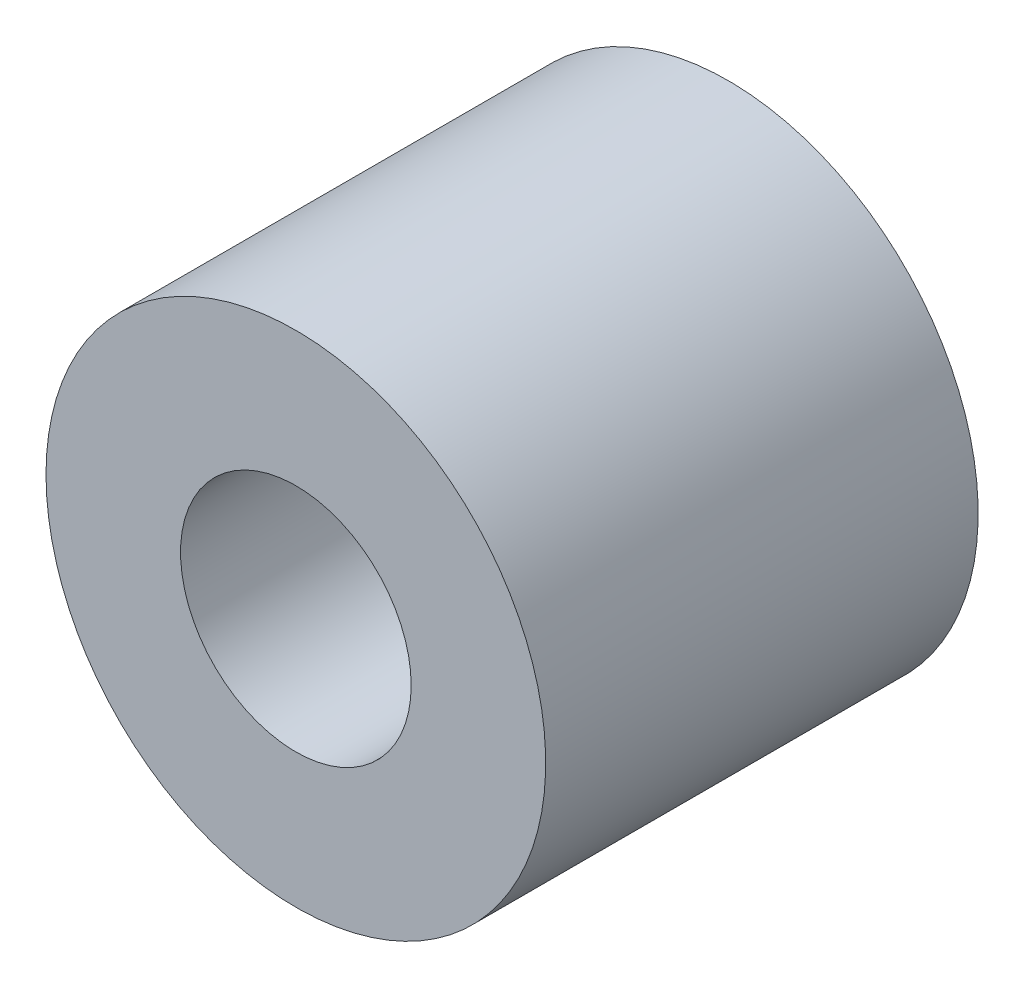
ISO-10303-21;
HEADER;
FILE_DESCRIPTION(('STEP AP214'),'2;1');
FILE_NAME('part.step','',(''),(''),'','','');
FILE_SCHEMA(('AUTOMOTIVE_DESIGN { 1 0 10303 214 1 1 1 1 }'));
ENDSEC;
DATA;
#1=APPLICATION_CONTEXT('core data for automotive mechanical design processes');
#2=APPLICATION_PROTOCOL_DEFINITION('international standard','automotive_design',2000,#1);
#3=PRODUCT_CONTEXT('',#1,'mechanical');
#4=PRODUCT('Part','Part','',(#3));
#5=PRODUCT_RELATED_PRODUCT_CATEGORY('part','',(#4));
#6=PRODUCT_DEFINITION_FORMATION('','',#4);
#7=PRODUCT_DEFINITION_CONTEXT('part definition',#1,'design');
#8=PRODUCT_DEFINITION('design','',#6,#7);
#9=PRODUCT_DEFINITION_SHAPE('','',#8);
#10=(LENGTH_UNIT() NAMED_UNIT(*) SI_UNIT(.MILLI.,.METRE.));
#11=(NAMED_UNIT(*) PLANE_ANGLE_UNIT() SI_UNIT($,.RADIAN.));
#12=(NAMED_UNIT(*) SI_UNIT($,.STERADIAN.) SOLID_ANGLE_UNIT());
#13=UNCERTAINTY_MEASURE_WITH_UNIT(LENGTH_MEASURE(1.E-05),#10,'distance_accuracy_value','');
#14=(GEOMETRIC_REPRESENTATION_CONTEXT(3) GLOBAL_UNCERTAINTY_ASSIGNED_CONTEXT((#13)) GLOBAL_UNIT_ASSIGNED_CONTEXT((#10,
#11,#12)) REPRESENTATION_CONTEXT('',''));
#15=CARTESIAN_POINT('',(0.,0.,0.));
#16=DIRECTION('',(0.,0.,1.));
#17=DIRECTION('',(1.,0.,0.));
#18=AXIS2_PLACEMENT_3D('',#15,#16,#17);
#19=CARTESIAN_POINT('',(0.,0.,45.));
#20=DIRECTION('',(0.,0.,-1.));
#21=DIRECTION('',(-1.,0.,0.));
#22=AXIS2_PLACEMENT_3D('',#19,#20,#21);
#23=CYLINDRICAL_SURFACE('',#22,26.);
#24=CARTESIAN_POINT('',(0.,0.,45.));
#25=DIRECTION('',(0.,0.,1.));
#26=DIRECTION('',(1.,0.,0.));
#27=AXIS2_PLACEMENT_3D('',#24,#25,#26);
#28=CIRCLE('',#27,26.);
#29=CARTESIAN_POINT('',(-26.,0.,45.));
#30=VERTEX_POINT('',#29);
#31=EDGE_CURVE('E10',#30,#30,#28,.T.);
#32=CARTESIAN_POINT('',(0.,0.,0.));
#33=DIRECTION('',(0.,0.,1.));
#34=DIRECTION('',(1.,0.,0.));
#35=AXIS2_PLACEMENT_3D('',#32,#33,#34);
#36=CIRCLE('',#35,26.);
#37=CARTESIAN_POINT('',(-26.,0.,0.));
#38=VERTEX_POINT('',#37);
#39=EDGE_CURVE('E36',#38,#38,#36,.T.);
#40=CARTESIAN_POINT('',(-26.,0.,45.));
#41=CARTESIAN_POINT('',(-26.,0.,44.53125));
#42=CARTESIAN_POINT('',(-26.,0.,44.0625));
#43=CARTESIAN_POINT('',(-26.,0.,43.125));
#44=CARTESIAN_POINT('',(-26.,0.,42.65625));
#45=CARTESIAN_POINT('',(-26.,0.,41.71875));
#46=CARTESIAN_POINT('',(-26.,0.,41.25));
#47=CARTESIAN_POINT('',(-26.,0.,40.3125));
#48=CARTESIAN_POINT('',(-26.,0.,39.84375));
#49=CARTESIAN_POINT('',(-26.,0.,38.90625));
#50=CARTESIAN_POINT('',(-26.,0.,38.4375));
#51=CARTESIAN_POINT('',(-26.,0.,37.5));
#52=CARTESIAN_POINT('',(-26.,0.,37.03125));
#53=CARTESIAN_POINT('',(-26.,0.,36.09375));
#54=CARTESIAN_POINT('',(-26.,0.,35.625));
#55=CARTESIAN_POINT('',(-26.,0.,34.6875));
#56=CARTESIAN_POINT('',(-26.,0.,34.21875));
#57=CARTESIAN_POINT('',(-26.,0.,33.28125));
#58=CARTESIAN_POINT('',(-26.,0.,32.8125));
#59=CARTESIAN_POINT('',(-26.,0.,31.875));
#60=CARTESIAN_POINT('',(-26.,0.,31.40625));
#61=CARTESIAN_POINT('',(-26.,0.,30.46875));
#62=CARTESIAN_POINT('',(-26.,0.,30.));
#63=CARTESIAN_POINT('',(-26.,0.,29.0625));
#64=CARTESIAN_POINT('',(-26.,0.,28.59375));
#65=CARTESIAN_POINT('',(-26.,0.,27.65625));
#66=CARTESIAN_POINT('',(-26.,0.,27.1875));
#67=CARTESIAN_POINT('',(-26.,0.,26.25));
#68=CARTESIAN_POINT('',(-26.,0.,25.78125));
#69=CARTESIAN_POINT('',(-26.,0.,24.84375));
#70=CARTESIAN_POINT('',(-26.,0.,24.375));
#71=CARTESIAN_POINT('',(-26.,0.,23.4375));
#72=CARTESIAN_POINT('',(-26.,0.,22.96875));
#73=CARTESIAN_POINT('',(-26.,0.,22.03125));
#74=CARTESIAN_POINT('',(-26.,0.,21.5625));
#75=CARTESIAN_POINT('',(-26.,0.,20.625));
#76=CARTESIAN_POINT('',(-26.,0.,20.15625));
#77=CARTESIAN_POINT('',(-26.,0.,19.21875));
#78=CARTESIAN_POINT('',(-26.,0.,18.75));
#79=CARTESIAN_POINT('',(-26.,0.,17.8125));
#80=CARTESIAN_POINT('',(-26.,0.,17.34375));
#81=CARTESIAN_POINT('',(-26.,0.,16.40625));
#82=CARTESIAN_POINT('',(-26.,0.,15.9375));
#83=CARTESIAN_POINT('',(-26.,0.,15.));
#84=CARTESIAN_POINT('',(-26.,0.,14.53125));
#85=CARTESIAN_POINT('',(-26.,0.,13.59375));
#86=CARTESIAN_POINT('',(-26.,0.,13.125));
#87=CARTESIAN_POINT('',(-26.,0.,12.1875));
#88=CARTESIAN_POINT('',(-26.,0.,11.71875));
#89=CARTESIAN_POINT('',(-26.,0.,10.78125));
#90=CARTESIAN_POINT('',(-26.,0.,10.3125));
#91=CARTESIAN_POINT('',(-26.,0.,9.375));
#92=CARTESIAN_POINT('',(-26.,0.,8.90625));
#93=CARTESIAN_POINT('',(-26.,0.,7.96874999999999));
#94=CARTESIAN_POINT('',(-26.,0.,7.5));
#95=CARTESIAN_POINT('',(-26.,0.,6.5625));
#96=CARTESIAN_POINT('',(-26.,0.,6.09375));
#97=CARTESIAN_POINT('',(-26.,0.,5.15625));
#98=CARTESIAN_POINT('',(-26.,0.,4.68749999999999));
#99=CARTESIAN_POINT('',(-26.,0.,3.74999999999999));
#100=CARTESIAN_POINT('',(-26.,0.,3.28124999999999));
#101=CARTESIAN_POINT('',(-26.,0.,2.34374999999999));
#102=CARTESIAN_POINT('',(-26.,0.,1.87499999999999));
#103=CARTESIAN_POINT('',(-26.,0.,0.937499999999992));
#104=CARTESIAN_POINT('',(-26.,0.,0.468749999999993));
#105=CARTESIAN_POINT('',(-26.,0.,0.));
#106=B_SPLINE_CURVE_WITH_KNOTS('',3,(#40,#41,#42,#43,#44,#45,#46,#47,#48,#49,#50,#51,#52,#53,
#54,#55,#56,#57,#58,#59,#60,#61,#62,#63,#64,#65,#66,#67,#68,#69,#70,#71,#72,#73,#74,#75,#76,#77,
#78,#79,#80,#81,#82,#83,#84,#85,#86,#87,#88,#89,#90,#91,#92,#93,#94,#95,#96,#97,#98,#99,#100,
#101,#102,#103,#104,#105),.UNSPECIFIED.,.F.,.F.,(4,2,2,2,2,2,2,2,2,2,2,2,2,2,2,2,2,2,2,2,2,2,2,
2,2,2,2,2,2,2,2,2,4),(0.,1.40625,2.8125,4.21875000000001,5.62500000000001,7.03125,8.4375,
9.84375000000001,11.25,12.65625,14.0625,15.46875,16.875,18.28125,19.6875,21.09375,22.5,23.90625,
25.3125,26.71875,28.125,29.53125,30.9375,32.34375,33.75,35.15625,36.5625,37.96875,39.375,
40.78125,42.1875,43.59375,45.),.UNSPECIFIED.);
#107=EDGE_CURVE('BSEAM33',#30,#38,#106,.T.);
#108=ORIENTED_EDGE('',*,*,#31,.F.);
#109=ORIENTED_EDGE('',*,*,#39,.T.);
#110=ORIENTED_EDGE('',*,*,#107,.T.);
#111=ORIENTED_EDGE('',*,*,#107,.F.);
#112=EDGE_LOOP('',(#108,#110,#109,#111));
#113=FACE_BOUND('',#112,.T.);
#114=ADVANCED_FACE('F33',(#113),#23,.T.);
#115=CARTESIAN_POINT('',(0.,0.,45.));
#116=DIRECTION('',(0.,0.,1.));
#117=DIRECTION('',(1.,0.,0.));
#118=AXIS2_PLACEMENT_3D('',#115,#116,#117);
#119=PLANE('',#118);
#120=CARTESIAN_POINT('',(0.,0.,45.));
#121=DIRECTION('',(0.,0.,1.));
#122=DIRECTION('',(1.,0.,0.));
#123=AXIS2_PLACEMENT_3D('',#120,#121,#122);
#124=CIRCLE('',#123,12.);
#125=CARTESIAN_POINT('',(12.,0.,45.));
#126=VERTEX_POINT('',#125);
#127=EDGE_CURVE('E45',#126,#126,#124,.T.);
#128=ORIENTED_EDGE('',*,*,#127,.F.);
#129=EDGE_LOOP('',(#128));
#130=FACE_BOUND('',#129,.T.);
#131=ORIENTED_EDGE('',*,*,#31,.T.);
#132=EDGE_LOOP('',(#131));
#133=FACE_BOUND('',#132,.T.);
#134=ADVANCED_FACE('F60',(#130,#133),#119,.T.);
#135=CARTESIAN_POINT('',(0.,0.,0.));
#136=DIRECTION('',(0.,0.,1.));
#137=DIRECTION('',(1.,0.,0.));
#138=AXIS2_PLACEMENT_3D('',#135,#136,#137);
#139=PLANE('',#138);
#140=CARTESIAN_POINT('',(0.,0.,0.));
#141=DIRECTION('',(0.,0.,1.));
#142=DIRECTION('',(1.,0.,0.));
#143=AXIS2_PLACEMENT_3D('',#140,#141,#142);
#144=CIRCLE('',#143,12.);
#145=CARTESIAN_POINT('',(12.,0.,0.));
#146=VERTEX_POINT('',#145);
#147=EDGE_CURVE('E43',#146,#146,#144,.T.);
#148=ORIENTED_EDGE('',*,*,#147,.T.);
#149=EDGE_LOOP('',(#148));
#150=FACE_BOUND('',#149,.T.);
#151=ORIENTED_EDGE('',*,*,#39,.F.);
#152=EDGE_LOOP('',(#151));
#153=FACE_BOUND('',#152,.T.);
#154=ADVANCED_FACE('F51',(#150,#153),#139,.F.);
#155=CARTESIAN_POINT('',(0.,0.,0.));
#156=DIRECTION('',(0.,0.,1.));
#157=DIRECTION('',(1.,0.,0.));
#158=AXIS2_PLACEMENT_3D('',#155,#156,#157);
#159=CYLINDRICAL_SURFACE('',#158,12.);
#160=CARTESIAN_POINT('',(12.,0.,0.));
#161=CARTESIAN_POINT('',(12.,0.,0.468749999999999));
#162=CARTESIAN_POINT('',(12.,0.,0.9375));
#163=CARTESIAN_POINT('',(12.,0.,1.875));
#164=CARTESIAN_POINT('',(12.,0.,2.34375));
#165=CARTESIAN_POINT('',(12.,0.,3.28125));
#166=CARTESIAN_POINT('',(12.,0.,3.75));
#167=CARTESIAN_POINT('',(12.,0.,4.6875));
#168=CARTESIAN_POINT('',(12.,0.,5.15625));
#169=CARTESIAN_POINT('',(12.,0.,6.09375));
#170=CARTESIAN_POINT('',(12.,0.,6.5625));
#171=CARTESIAN_POINT('',(12.,0.,7.5));
#172=CARTESIAN_POINT('',(12.,0.,7.96875));
#173=CARTESIAN_POINT('',(12.,0.,8.90625));
#174=CARTESIAN_POINT('',(12.,0.,9.375));
#175=CARTESIAN_POINT('',(12.,0.,10.3125));
#176=CARTESIAN_POINT('',(12.,0.,10.78125));
#177=CARTESIAN_POINT('',(12.,0.,11.71875));
#178=CARTESIAN_POINT('',(12.,0.,12.1875));
#179=CARTESIAN_POINT('',(12.,0.,13.125));
#180=CARTESIAN_POINT('',(12.,0.,13.59375));
#181=CARTESIAN_POINT('',(12.,0.,14.53125));
#182=CARTESIAN_POINT('',(12.,0.,15.));
#183=CARTESIAN_POINT('',(12.,0.,15.9375));
#184=CARTESIAN_POINT('',(12.,0.,16.40625));
#185=CARTESIAN_POINT('',(12.,0.,17.34375));
#186=CARTESIAN_POINT('',(12.,0.,17.8125));
#187=CARTESIAN_POINT('',(12.,0.,18.75));
#188=CARTESIAN_POINT('',(12.,0.,19.21875));
#189=CARTESIAN_POINT('',(12.,0.,20.15625));
#190=CARTESIAN_POINT('',(12.,0.,20.625));
#191=CARTESIAN_POINT('',(12.,0.,21.5625));
#192=CARTESIAN_POINT('',(12.,0.,22.03125));
#193=CARTESIAN_POINT('',(12.,0.,22.96875));
#194=CARTESIAN_POINT('',(12.,0.,23.4375));
#195=CARTESIAN_POINT('',(12.,0.,24.375));
#196=CARTESIAN_POINT('',(12.,0.,24.84375));
#197=CARTESIAN_POINT('',(12.,0.,25.78125));
#198=CARTESIAN_POINT('',(12.,0.,26.25));
#199=CARTESIAN_POINT('',(12.,0.,27.1875));
#200=CARTESIAN_POINT('',(12.,0.,27.65625));
#201=CARTESIAN_POINT('',(12.,0.,28.59375));
#202=CARTESIAN_POINT('',(12.,0.,29.0625));
#203=CARTESIAN_POINT('',(12.,0.,30.));
#204=CARTESIAN_POINT('',(12.,0.,30.46875));
#205=CARTESIAN_POINT('',(12.,0.,31.40625));
#206=CARTESIAN_POINT('',(12.,0.,31.875));
#207=CARTESIAN_POINT('',(12.,0.,32.8125));
#208=CARTESIAN_POINT('',(12.,0.,33.28125));
#209=CARTESIAN_POINT('',(12.,0.,34.21875));
#210=CARTESIAN_POINT('',(12.,0.,34.6875));
#211=CARTESIAN_POINT('',(12.,0.,35.625));
#212=CARTESIAN_POINT('',(12.,0.,36.09375));
#213=CARTESIAN_POINT('',(12.,0.,37.03125));
#214=CARTESIAN_POINT('',(12.,0.,37.5));
#215=CARTESIAN_POINT('',(12.,0.,38.4375));
#216=CARTESIAN_POINT('',(12.,0.,38.90625));
#217=CARTESIAN_POINT('',(12.,0.,39.84375));
#218=CARTESIAN_POINT('',(12.,0.,40.3125));
#219=CARTESIAN_POINT('',(12.,0.,41.25));
#220=CARTESIAN_POINT('',(12.,0.,41.71875));
#221=CARTESIAN_POINT('',(12.,0.,42.65625));
#222=CARTESIAN_POINT('',(12.,0.,43.125));
#223=CARTESIAN_POINT('',(12.,0.,44.0625));
#224=CARTESIAN_POINT('',(12.,0.,44.53125));
#225=CARTESIAN_POINT('',(12.,0.,45.));
#226=B_SPLINE_CURVE_WITH_KNOTS('',3,(#160,#161,#162,#163,#164,#165,#166,#167,#168,#169,#170,
#171,#172,#173,#174,#175,#176,#177,#178,#179,#180,#181,#182,#183,#184,#185,#186,#187,#188,#189,
#190,#191,#192,#193,#194,#195,#196,#197,#198,#199,#200,#201,#202,#203,#204,#205,#206,#207,#208,
#209,#210,#211,#212,#213,#214,#215,#216,#217,#218,#219,#220,#221,#222,#223,#224,#225),
.UNSPECIFIED.,.F.,.F.,(4,2,2,2,2,2,2,2,2,2,2,2,2,2,2,2,2,2,2,2,2,2,2,2,2,2,2,2,2,2,2,2,4),(0.,
1.40625,2.8125,4.21875,5.625,7.03125,8.4375,9.84375,11.25,12.65625,14.0625,15.46875,16.875,
18.28125,19.6875,21.09375,22.5,23.90625,25.3125,26.71875,28.125,29.53125,30.9375,32.34375,33.75,
35.15625,36.5625,37.96875,39.375,40.78125,42.1875,43.59375,45.),.UNSPECIFIED.);
#227=EDGE_CURVE('BSEAM54',#146,#126,#226,.T.);
#228=ORIENTED_EDGE('',*,*,#147,.F.);
#229=ORIENTED_EDGE('',*,*,#127,.T.);
#230=ORIENTED_EDGE('',*,*,#227,.T.);
#231=ORIENTED_EDGE('',*,*,#227,.F.);
#232=EDGE_LOOP('',(#228,#230,#229,#231));
#233=FACE_BOUND('',#232,.T.);
#234=ADVANCED_FACE('F54',(#233),#159,.F.);
#235=CLOSED_SHELL('',(#114,#134,#154,#234));
#236=MANIFOLD_SOLID_BREP('B2',#235);
#237=ADVANCED_BREP_SHAPE_REPRESENTATION('',(#18,#236),#14);
#238=SHAPE_DEFINITION_REPRESENTATION(#9,#237);
ENDSEC;
END-ISO-10303-21;
